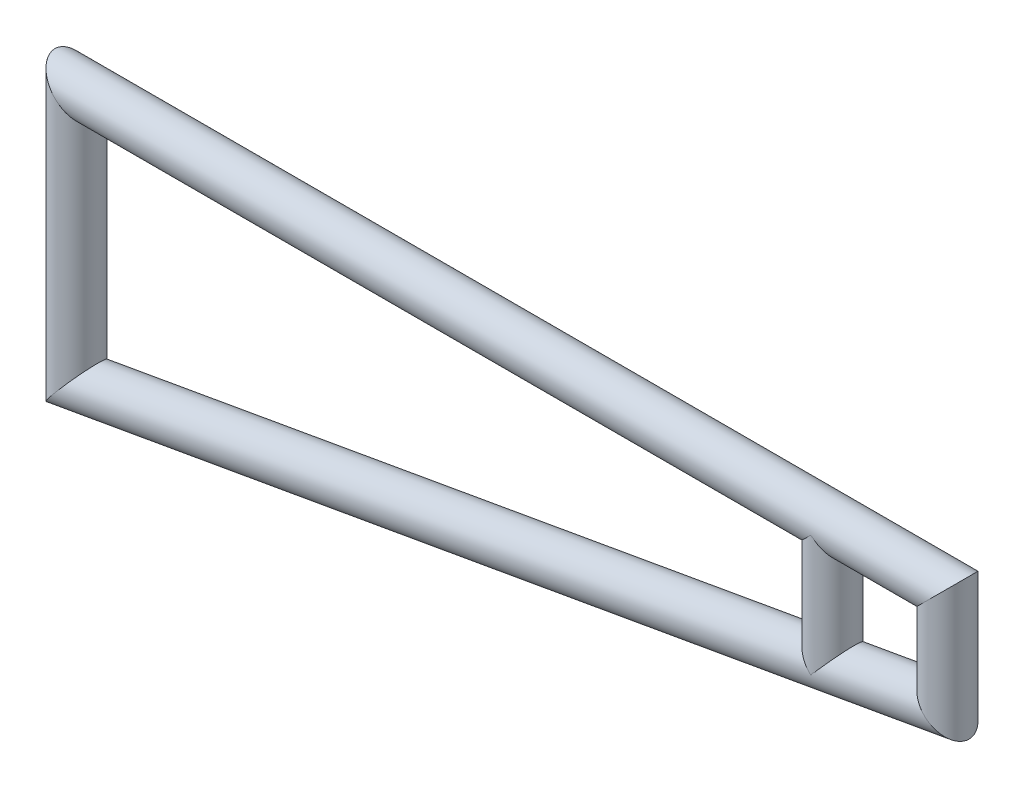
ISO-10303-21;
HEADER;
FILE_DESCRIPTION(('STEP AP214'),'2;1');
FILE_NAME('part.step','',(''),(''),'','','');
FILE_SCHEMA(('AUTOMOTIVE_DESIGN { 1 0 10303 214 1 1 1 1 }'));
ENDSEC;
DATA;
#1=APPLICATION_CONTEXT('core data for automotive mechanical design processes');
#2=APPLICATION_PROTOCOL_DEFINITION('international standard','automotive_design',2000,#1);
#3=PRODUCT_CONTEXT('',#1,'mechanical');
#4=PRODUCT('Part','Part','',(#3));
#5=PRODUCT_RELATED_PRODUCT_CATEGORY('part','',(#4));
#6=PRODUCT_DEFINITION_FORMATION('','',#4);
#7=PRODUCT_DEFINITION_CONTEXT('part definition',#1,'design');
#8=PRODUCT_DEFINITION('design','',#6,#7);
#9=PRODUCT_DEFINITION_SHAPE('','',#8);
#10=(LENGTH_UNIT() NAMED_UNIT(*) SI_UNIT(.MILLI.,.METRE.));
#11=(NAMED_UNIT(*) PLANE_ANGLE_UNIT() SI_UNIT($,.RADIAN.));
#12=(NAMED_UNIT(*) SI_UNIT($,.STERADIAN.) SOLID_ANGLE_UNIT());
#13=UNCERTAINTY_MEASURE_WITH_UNIT(LENGTH_MEASURE(1.E-05),#10,'distance_accuracy_value','');
#14=(GEOMETRIC_REPRESENTATION_CONTEXT(3) GLOBAL_UNCERTAINTY_ASSIGNED_CONTEXT((#13)) GLOBAL_UNIT_ASSIGNED_CONTEXT((#10,
#11,#12)) REPRESENTATION_CONTEXT('',''));
#15=CARTESIAN_POINT('',(0.,0.,0.));
#16=DIRECTION('',(0.,0.,1.));
#17=DIRECTION('',(1.,0.,0.));
#18=AXIS2_PLACEMENT_3D('',#15,#16,#17);
#19=CARTESIAN_POINT('',(0.,125.82060170464,0.));
#20=DIRECTION('',(0.,-1.,0.));
#21=DIRECTION('',(0.,0.,-1.));
#22=AXIS2_PLACEMENT_3D('',#19,#20,#21);
#23=CYLINDRICAL_SURFACE('',#22,7.8994);
#24=CARTESIAN_POINT('',(0.,125.82060170464,0.));
#25=DIRECTION('',(0.707106781186547,0.707106781186548,0.));
#26=DIRECTION('',(0.707106781186548,-0.707106781186547,0.));
#27=AXIS2_PLACEMENT_3D('',#24,#25,#26);
#28=ELLIPSE('',#27,11.17143861461,7.8994);
#29=CARTESIAN_POINT('',(7.8994,117.92120170464,0.));
#30=VERTEX_POINT('',#29);
#31=EDGE_CURVE('E61',#30,#30,#28,.T.);
#32=ORIENTED_EDGE('',*,*,#31,.T.);
#33=EDGE_LOOP('',(#32));
#34=FACE_BOUND('',#33,.T.);
#35=CARTESIAN_POINT('',(0.,0.,0.));
#36=DIRECTION('',(0.766044443118978,-0.642787609686539,0.));
#37=DIRECTION('',(-0.642787609686539,-0.766044443118978,0.));
#38=AXIS2_PLACEMENT_3D('',#35,#36,#37);
#39=ELLIPSE('',#38,12.2892847979011,7.8994);
#40=CARTESIAN_POINT('',(-7.8994,-9.41413832933871,0.));
#41=VERTEX_POINT('',#40);
#42=EDGE_CURVE('E51',#41,#41,#39,.T.);
#43=ORIENTED_EDGE('',*,*,#42,.T.);
#44=EDGE_LOOP('',(#43));
#45=FACE_BOUND('',#44,.T.);
#46=ADVANCED_FACE('F47',(#34,#45),#23,.F.);
#47=CARTESIAN_POINT('',(0.,125.82060170464,0.));
#48=DIRECTION('',(0.,-1.,0.));
#49=DIRECTION('',(0.,0.,-1.));
#50=AXIS2_PLACEMENT_3D('',#47,#48,#49);
#51=CYLINDRICAL_SURFACE('',#50,10.668);
#52=CARTESIAN_POINT('',(0.,125.82060170464,0.));
#53=DIRECTION('',(0.707106781186547,0.707106781186548,0.));
#54=DIRECTION('',(0.707106781186548,-0.707106781186547,0.));
#55=AXIS2_PLACEMENT_3D('',#52,#53,#54);
#56=ELLIPSE('',#55,15.0868302833962,10.668);
#57=CARTESIAN_POINT('',(10.668,115.15260170464,0.));
#58=VERTEX_POINT('',#57);
#59=EDGE_CURVE('E55',#58,#58,#56,.T.);
#60=ORIENTED_EDGE('',*,*,#59,.F.);
#61=EDGE_LOOP('',(#60));
#62=FACE_BOUND('',#61,.T.);
#63=CARTESIAN_POINT('',(0.,0.,0.));
#64=DIRECTION('',(0.766044443118978,-0.642787609686539,0.));
#65=DIRECTION('',(-0.642787609686539,-0.766044443118978,0.));
#66=AXIS2_PLACEMENT_3D('',#63,#64,#65);
#67=ELLIPSE('',#66,16.5964617849469,10.668);
#68=CARTESIAN_POINT('',(-10.668,-12.713627325795,0.));
#69=VERTEX_POINT('',#68);
#70=EDGE_CURVE('E12',#69,#69,#67,.T.);
#71=ORIENTED_EDGE('',*,*,#70,.F.);
#72=EDGE_LOOP('',(#71));
#73=FACE_BOUND('',#72,.T.);
#74=ADVANCED_FACE('F74',(#62,#73),#51,.T.);
#75=CARTESIAN_POINT('',(0.,125.82060170464,0.));
#76=DIRECTION('',(0.707106781186547,0.707106781186548,0.));
#77=DIRECTION('',(-0.707106781186548,0.707106781186547,0.));
#78=AXIS2_PLACEMENT_3D('',#75,#76,#77);
#79=PLANE('',#78);
#80=ORIENTED_EDGE('',*,*,#31,.F.);
#81=EDGE_LOOP('',(#80));
#82=FACE_BOUND('',#81,.T.);
#83=ORIENTED_EDGE('',*,*,#59,.T.);
#84=EDGE_LOOP('',(#83));
#85=FACE_BOUND('',#84,.T.);
#86=ADVANCED_FACE('F70',(#82,#85),#79,.T.);
#87=CARTESIAN_POINT('',(0.,0.,0.));
#88=DIRECTION('',(0.766044443118978,-0.642787609686539,0.));
#89=DIRECTION('',(0.642787609686539,0.766044443118978,0.));
#90=AXIS2_PLACEMENT_3D('',#87,#88,#89);
#91=PLANE('',#90);
#92=ORIENTED_EDGE('',*,*,#42,.F.);
#93=EDGE_LOOP('',(#92));
#94=FACE_BOUND('',#93,.T.);
#95=ORIENTED_EDGE('',*,*,#70,.T.);
#96=EDGE_LOOP('',(#95));
#97=FACE_BOUND('',#96,.T.);
#98=ADVANCED_FACE('F49',(#94,#97),#91,.T.);
#99=CLOSED_SHELL('',(#46,#74,#86,#98));
#100=MANIFOLD_SOLID_BREP('B2',#99);
#101=CARTESIAN_POINT('',(0.,0.,0.));
#102=DIRECTION('',(0.984807753012208,0.173648177666931,0.));
#103=DIRECTION('',(-0.173648177666931,0.984807753012208,0.));
#104=AXIS2_PLACEMENT_3D('',#101,#102,#103);
#105=CYLINDRICAL_SURFACE('',#104,7.8994);
#106=CARTESIAN_POINT('',(430.,75.8206017046404,0.));
#107=DIRECTION('',(0.642787609686539,0.766044443118978,0.));
#108=DIRECTION('',(0.766044443118978,-0.642787609686539,0.));
#109=AXIS2_PLACEMENT_3D('',#106,#107,#108);
#110=ELLIPSE('',#109,10.3119343413514,7.8994);
#111=CARTESIAN_POINT('',(437.8994,69.1922180781186,0.));
#112=VERTEX_POINT('',#111);
#113=EDGE_CURVE('E153',#112,#112,#110,.T.);
#114=ORIENTED_EDGE('',*,*,#113,.T.);
#115=EDGE_LOOP('',(#114));
#116=FACE_BOUND('',#115,.T.);
#117=CARTESIAN_POINT('',(0.,0.,0.));
#118=DIRECTION('',(-0.766044443118978,0.642787609686539,0.));
#119=DIRECTION('',(0.642787609686539,0.766044443118978,0.));
#120=AXIS2_PLACEMENT_3D('',#117,#118,#119);
#121=ELLIPSE('',#120,12.2892847979011,7.8994);
#122=CARTESIAN_POINT('',(7.89940000000004,9.41413832933875,0.));
#123=VERTEX_POINT('',#122);
#124=EDGE_CURVE('E143',#123,#123,#121,.T.);
#125=ORIENTED_EDGE('',*,*,#124,.T.);
#126=EDGE_LOOP('',(#125));
#127=FACE_BOUND('',#126,.T.);
#128=ADVANCED_FACE('F139',(#116,#127),#105,.F.);
#129=CARTESIAN_POINT('',(0.,0.,0.));
#130=DIRECTION('',(0.984807753012208,0.173648177666931,0.));
#131=DIRECTION('',(-0.173648177666931,0.984807753012208,0.));
#132=AXIS2_PLACEMENT_3D('',#129,#130,#131);
#133=CYLINDRICAL_SURFACE('',#132,10.668);
#134=CARTESIAN_POINT('',(430.,75.8206017046404,0.));
#135=DIRECTION('',(0.642787609686539,0.766044443118978,0.));
#136=DIRECTION('',(0.766044443118978,-0.642787609686539,0.));
#137=AXIS2_PLACEMENT_3D('',#134,#135,#136);
#138=ELLIPSE('',#137,13.9260849625967,10.668);
#139=CARTESIAN_POINT('',(440.668,66.8690868392412,0.));
#140=VERTEX_POINT('',#139);
#141=EDGE_CURVE('E147',#140,#140,#138,.T.);
#142=ORIENTED_EDGE('',*,*,#141,.F.);
#143=EDGE_LOOP('',(#142));
#144=FACE_BOUND('',#143,.T.);
#145=CARTESIAN_POINT('',(0.,0.,0.));
#146=DIRECTION('',(-0.766044443118978,0.642787609686539,0.));
#147=DIRECTION('',(0.642787609686539,0.766044443118978,0.));
#148=AXIS2_PLACEMENT_3D('',#145,#146,#147);
#149=ELLIPSE('',#148,16.5964617849469,10.668);
#150=CARTESIAN_POINT('',(10.668,12.7136273257951,0.));
#151=VERTEX_POINT('',#150);
#152=EDGE_CURVE('E46',#151,#151,#149,.T.);
#153=ORIENTED_EDGE('',*,*,#152,.F.);
#154=EDGE_LOOP('',(#153));
#155=FACE_BOUND('',#154,.T.);
#156=ADVANCED_FACE('F166',(#144,#155),#133,.T.);
#157=CARTESIAN_POINT('',(430.,75.8206017046404,0.));
#158=DIRECTION('',(0.642787609686539,0.766044443118978,0.));
#159=DIRECTION('',(-0.766044443118978,0.642787609686539,0.));
#160=AXIS2_PLACEMENT_3D('',#157,#158,#159);
#161=PLANE('',#160);
#162=ORIENTED_EDGE('',*,*,#113,.F.);
#163=EDGE_LOOP('',(#162));
#164=FACE_BOUND('',#163,.T.);
#165=ORIENTED_EDGE('',*,*,#141,.T.);
#166=EDGE_LOOP('',(#165));
#167=FACE_BOUND('',#166,.T.);
#168=ADVANCED_FACE('F162',(#164,#167),#161,.T.);
#169=CARTESIAN_POINT('',(0.,0.,0.));
#170=DIRECTION('',(-0.766044443118978,0.642787609686539,0.));
#171=DIRECTION('',(-0.642787609686539,-0.766044443118978,0.));
#172=AXIS2_PLACEMENT_3D('',#169,#170,#171);
#173=PLANE('',#172);
#174=ORIENTED_EDGE('',*,*,#124,.F.);
#175=EDGE_LOOP('',(#174));
#176=FACE_BOUND('',#175,.T.);
#177=ORIENTED_EDGE('',*,*,#152,.T.);
#178=EDGE_LOOP('',(#177));
#179=FACE_BOUND('',#178,.T.);
#180=ADVANCED_FACE('F141',(#176,#179),#173,.T.);
#181=CLOSED_SHELL('',(#128,#156,#168,#180));
#182=MANIFOLD_SOLID_BREP('B7',#181);
#183=CARTESIAN_POINT('',(430.,125.82060170464,0.));
#184=DIRECTION('',(-1.,0.,0.));
#185=DIRECTION('',(0.,0.,1.));
#186=AXIS2_PLACEMENT_3D('',#183,#184,#185);
#187=CYLINDRICAL_SURFACE('',#186,7.8994);
#188=CARTESIAN_POINT('',(430.,125.82060170464,0.));
#189=DIRECTION('',(0.707106781186548,-0.707106781186547,0.));
#190=DIRECTION('',(-0.707106781186547,-0.707106781186548,0.));
#191=AXIS2_PLACEMENT_3D('',#188,#189,#190);
#192=ELLIPSE('',#191,11.17143861461,7.8994);
#193=CARTESIAN_POINT('',(422.1006,117.92120170464,0.));
#194=VERTEX_POINT('',#193);
#195=EDGE_CURVE('E245',#194,#194,#192,.T.);
#196=ORIENTED_EDGE('',*,*,#195,.T.);
#197=EDGE_LOOP('',(#196));
#198=FACE_BOUND('',#197,.T.);
#199=CARTESIAN_POINT('',(0.,125.82060170464,0.));
#200=DIRECTION('',(-0.707106781186548,-0.707106781186547,0.));
#201=DIRECTION('',(-0.707106781186547,0.707106781186548,0.));
#202=AXIS2_PLACEMENT_3D('',#199,#200,#201);
#203=ELLIPSE('',#202,11.17143861461,7.8994);
#204=CARTESIAN_POINT('',(-7.8994,133.72000170464,0.));
#205=VERTEX_POINT('',#204);
#206=EDGE_CURVE('E235',#205,#205,#203,.T.);
#207=ORIENTED_EDGE('',*,*,#206,.T.);
#208=EDGE_LOOP('',(#207));
#209=FACE_BOUND('',#208,.T.);
#210=ADVANCED_FACE('F231',(#198,#209),#187,.F.);
#211=CARTESIAN_POINT('',(430.,125.82060170464,0.));
#212=DIRECTION('',(-1.,0.,0.));
#213=DIRECTION('',(0.,0.,1.));
#214=AXIS2_PLACEMENT_3D('',#211,#212,#213);
#215=CYLINDRICAL_SURFACE('',#214,10.668);
#216=CARTESIAN_POINT('',(430.,125.82060170464,0.));
#217=DIRECTION('',(0.707106781186548,-0.707106781186547,0.));
#218=DIRECTION('',(-0.707106781186547,-0.707106781186548,0.));
#219=AXIS2_PLACEMENT_3D('',#216,#217,#218);
#220=ELLIPSE('',#219,15.0868302833962,10.668);
#221=CARTESIAN_POINT('',(419.332,115.15260170464,0.));
#222=VERTEX_POINT('',#221);
#223=EDGE_CURVE('E239',#222,#222,#220,.T.);
#224=ORIENTED_EDGE('',*,*,#223,.F.);
#225=EDGE_LOOP('',(#224));
#226=FACE_BOUND('',#225,.T.);
#227=CARTESIAN_POINT('',(0.,125.82060170464,0.));
#228=DIRECTION('',(-0.707106781186548,-0.707106781186547,0.));
#229=DIRECTION('',(-0.707106781186547,0.707106781186548,0.));
#230=AXIS2_PLACEMENT_3D('',#227,#228,#229);
#231=ELLIPSE('',#230,15.0868302833962,10.668);
#232=CARTESIAN_POINT('',(-10.668,136.48860170464,0.));
#233=VERTEX_POINT('',#232);
#234=EDGE_CURVE('E138',#233,#233,#231,.T.);
#235=ORIENTED_EDGE('',*,*,#234,.F.);
#236=EDGE_LOOP('',(#235));
#237=FACE_BOUND('',#236,.T.);
#238=ADVANCED_FACE('F258',(#226,#237),#215,.T.);
#239=CARTESIAN_POINT('',(430.,125.82060170464,0.));
#240=DIRECTION('',(0.707106781186548,-0.707106781186547,0.));
#241=DIRECTION('',(0.707106781186547,0.707106781186548,0.));
#242=AXIS2_PLACEMENT_3D('',#239,#240,#241);
#243=PLANE('',#242);
#244=ORIENTED_EDGE('',*,*,#195,.F.);
#245=EDGE_LOOP('',(#244));
#246=FACE_BOUND('',#245,.T.);
#247=ORIENTED_EDGE('',*,*,#223,.T.);
#248=EDGE_LOOP('',(#247));
#249=FACE_BOUND('',#248,.T.);
#250=ADVANCED_FACE('F254',(#246,#249),#243,.T.);
#251=CARTESIAN_POINT('',(0.,125.82060170464,0.));
#252=DIRECTION('',(-0.707106781186548,-0.707106781186547,0.));
#253=DIRECTION('',(0.707106781186547,-0.707106781186548,0.));
#254=AXIS2_PLACEMENT_3D('',#251,#252,#253);
#255=PLANE('',#254);
#256=ORIENTED_EDGE('',*,*,#206,.F.);
#257=EDGE_LOOP('',(#256));
#258=FACE_BOUND('',#257,.T.);
#259=ORIENTED_EDGE('',*,*,#234,.T.);
#260=EDGE_LOOP('',(#259));
#261=FACE_BOUND('',#260,.T.);
#262=ADVANCED_FACE('F233',(#258,#261),#255,.T.);
#263=CLOSED_SHELL('',(#210,#238,#250,#262));
#264=MANIFOLD_SOLID_BREP('B41',#263);
#265=CARTESIAN_POINT('',(430.,75.8206017046403,0.));
#266=DIRECTION('',(0.,1.,0.));
#267=DIRECTION('',(0.,0.,1.));
#268=AXIS2_PLACEMENT_3D('',#265,#266,#267);
#269=CYLINDRICAL_SURFACE('',#268,7.8994);
#270=CARTESIAN_POINT('',(430.,75.8206017046404,0.));
#271=DIRECTION('',(-0.642787609686539,-0.766044443118979,0.));
#272=DIRECTION('',(-0.766044443118978,0.642787609686539,0.));
#273=AXIS2_PLACEMENT_3D('',#270,#271,#272);
#274=ELLIPSE('',#273,10.3119343413514,7.8994);
#275=CARTESIAN_POINT('',(422.1006,82.4489853311622,0.));
#276=VERTEX_POINT('',#275);
#277=EDGE_CURVE('E338',#276,#276,#274,.T.);
#278=ORIENTED_EDGE('',*,*,#277,.T.);
#279=EDGE_LOOP('',(#278));
#280=FACE_BOUND('',#279,.T.);
#281=CARTESIAN_POINT('',(430.,125.82060170464,0.));
#282=DIRECTION('',(-0.707106781186548,0.707106781186547,0.));
#283=DIRECTION('',(0.707106781186547,0.707106781186548,0.));
#284=AXIS2_PLACEMENT_3D('',#281,#282,#283);
#285=ELLIPSE('',#284,11.17143861461,7.8994);
#286=CARTESIAN_POINT('',(437.8994,133.72000170464,0.));
#287=VERTEX_POINT('',#286);
#288=EDGE_CURVE('E328',#287,#287,#285,.T.);
#289=ORIENTED_EDGE('',*,*,#288,.T.);
#290=EDGE_LOOP('',(#289));
#291=FACE_BOUND('',#290,.T.);
#292=ADVANCED_FACE('F324',(#280,#291),#269,.F.);
#293=CARTESIAN_POINT('',(430.,75.8206017046403,0.));
#294=DIRECTION('',(0.,1.,0.));
#295=DIRECTION('',(0.,0.,1.));
#296=AXIS2_PLACEMENT_3D('',#293,#294,#295);
#297=CYLINDRICAL_SURFACE('',#296,10.668);
#298=CARTESIAN_POINT('',(430.,75.8206017046404,0.));
#299=DIRECTION('',(-0.642787609686539,-0.766044443118979,0.));
#300=DIRECTION('',(-0.766044443118978,0.642787609686539,0.));
#301=AXIS2_PLACEMENT_3D('',#298,#299,#300);
#302=ELLIPSE('',#301,13.9260849625967,10.668);
#303=CARTESIAN_POINT('',(419.332,84.7721165700396,0.));
#304=VERTEX_POINT('',#303);
#305=EDGE_CURVE('E332',#304,#304,#302,.T.);
#306=ORIENTED_EDGE('',*,*,#305,.F.);
#307=EDGE_LOOP('',(#306));
#308=FACE_BOUND('',#307,.T.);
#309=CARTESIAN_POINT('',(430.,125.82060170464,0.));
#310=DIRECTION('',(-0.707106781186548,0.707106781186547,0.));
#311=DIRECTION('',(0.707106781186547,0.707106781186548,0.));
#312=AXIS2_PLACEMENT_3D('',#309,#310,#311);
#313=ELLIPSE('',#312,15.0868302833962,10.668);
#314=CARTESIAN_POINT('',(440.668,136.48860170464,0.));
#315=VERTEX_POINT('',#314);
#316=EDGE_CURVE('E230',#315,#315,#313,.T.);
#317=ORIENTED_EDGE('',*,*,#316,.F.);
#318=EDGE_LOOP('',(#317));
#319=FACE_BOUND('',#318,.T.);
#320=ADVANCED_FACE('F351',(#308,#319),#297,.T.);
#321=CARTESIAN_POINT('',(430.,75.8206017046404,0.));
#322=DIRECTION('',(-0.642787609686539,-0.766044443118979,0.));
#323=DIRECTION('',(0.766044443118978,-0.642787609686539,0.));
#324=AXIS2_PLACEMENT_3D('',#321,#322,#323);
#325=PLANE('',#324);
#326=ORIENTED_EDGE('',*,*,#277,.F.);
#327=EDGE_LOOP('',(#326));
#328=FACE_BOUND('',#327,.T.);
#329=ORIENTED_EDGE('',*,*,#305,.T.);
#330=EDGE_LOOP('',(#329));
#331=FACE_BOUND('',#330,.T.);
#332=ADVANCED_FACE('F347',(#328,#331),#325,.T.);
#333=CARTESIAN_POINT('',(430.,125.82060170464,0.));
#334=DIRECTION('',(-0.707106781186548,0.707106781186547,0.));
#335=DIRECTION('',(-0.707106781186547,-0.707106781186548,0.));
#336=AXIS2_PLACEMENT_3D('',#333,#334,#335);
#337=PLANE('',#336);
#338=ORIENTED_EDGE('',*,*,#288,.F.);
#339=EDGE_LOOP('',(#338));
#340=FACE_BOUND('',#339,.T.);
#341=ORIENTED_EDGE('',*,*,#316,.T.);
#342=EDGE_LOOP('',(#341));
#343=FACE_BOUND('',#342,.T.);
#344=ADVANCED_FACE('F326',(#340,#343),#337,.T.);
#345=CLOSED_SHELL('',(#292,#320,#332,#344));
#346=MANIFOLD_SOLID_BREP('B133',#345);
#347=CARTESIAN_POINT('',(373.287181803823,65.8206017046404,0.));
#348=DIRECTION('',(0.,1.,0.));
#349=DIRECTION('',(0.,0.,1.));
#350=AXIS2_PLACEMENT_3D('',#347,#348,#349);
#351=CYLINDRICAL_SURFACE('',#350,7.8994);
#352=CARTESIAN_POINT('',(373.287181803823,118.650824606292,7.8994));
#353=CARTESIAN_POINT('',(373.472592037183,118.650821739568,7.89939862302274));
#354=CARTESIAN_POINT('',(373.658028702108,118.643592902203,7.89285461644663));
#355=CARTESIAN_POINT('',(374.026920029612,118.615113719013,7.86686245380208));
#356=CARTESIAN_POINT('',(374.210374173535,118.593859790158,7.84741100022344));
#357=CARTESIAN_POINT('',(374.573923363847,118.538497272383,7.79606283536288));
#358=CARTESIAN_POINT('',(374.75401068206,118.504362200233,7.76414047949351));
#359=CARTESIAN_POINT('',(375.109257128672,118.424951275809,7.6885353604366));
#360=CARTESIAN_POINT('',(375.28441330943,118.379668911342,7.64484572145131));
#361=CARTESIAN_POINT('',(375.626516080542,118.280592846337,7.54713520819791));
#362=CARTESIAN_POINT('',(375.79354240326,118.226924640039,7.49326453284778));
#363=CARTESIAN_POINT('',(376.121424240177,118.112486215787,7.3754960292405));
#364=CARTESIAN_POINT('',(376.28228039991,118.051716743487,7.31159925351447));
#365=CARTESIAN_POINT('',(376.755275864847,117.861337631017,7.1057087317883));
#366=CARTESIAN_POINT('',(377.058088919044,117.723581016258,6.9494428716133));
#367=CARTESIAN_POINT('',(377.521879343254,117.495007657165,6.6715141610299));
#368=CARTESIAN_POINT('',(377.691292296085,117.407360514528,6.56087606445238));
#369=CARTESIAN_POINT('',(378.020633813314,117.230376688343,6.32737567751919));
#370=CARTESIAN_POINT('',(378.18056161104,117.141039868989,6.20451240116305));
#371=CARTESIAN_POINT('',(378.490828128089,116.962411368081,5.94670748966839));
#372=CARTESIAN_POINT('',(378.641153133767,116.8731199241,5.81174921431244));
#373=CARTESIAN_POINT('',(378.931571850779,116.696371680899,5.53012578339758));
#374=CARTESIAN_POINT('',(379.071665539304,116.60891488577,5.38346060174179));
#375=CARTESIAN_POINT('',(379.367595194239,116.420513311941,5.04860061097395));
#376=CARTESIAN_POINT('',(379.521098759441,116.320303775458,4.85791504920804));
#377=CARTESIAN_POINT('',(379.811340811017,116.127376850364,4.46053864030585));
#378=CARTESIAN_POINT('',(379.948075666179,116.034661085983,4.25384434228289));
#379=CARTESIAN_POINT('',(380.202859203797,115.8594893341,3.82568500223123));
#380=CARTESIAN_POINT('',(380.320942051517,115.77701464852,3.60424804802914));
#381=CARTESIAN_POINT('',(380.536791072299,115.624686313849,3.14759886806422));
#382=CARTESIAN_POINT('',(380.634567602655,115.554826233031,2.91239374365862));
#383=CARTESIAN_POINT('',(380.782250885536,115.448524698911,2.50141435248169));
#384=CARTESIAN_POINT('',(380.837766330911,115.408307411922,2.32860804889637));
#385=CARTESIAN_POINT('',(380.937095330283,115.336055192159,1.97800783533073));
#386=CARTESIAN_POINT('',(380.980911624746,115.304018343236,1.80021510419764));
#387=CARTESIAN_POINT('',(381.056240669805,115.248784260288,1.44081057948632));
#388=CARTESIAN_POINT('',(381.08776153456,115.225581196801,1.25920138820825));
#389=CARTESIAN_POINT('',(381.138085432209,115.188475774467,0.89327395402296));
#390=CARTESIAN_POINT('',(381.156888013728,115.174573745718,0.708955615204549));
#391=CARTESIAN_POINT('',(381.181513267718,115.156357531583,0.338516516031186));
#392=CARTESIAN_POINT('',(381.187303546699,115.152067274314,0.152392413354144));
#393=CARTESIAN_POINT('',(381.18571639607,115.15324251517,-0.219767814756798));
#394=CARTESIAN_POINT('',(381.17833901788,115.158707975197,-0.405803940531413));
#395=CARTESIAN_POINT('',(381.150531469457,115.179272635939,-0.776395038390029));
#396=CARTESIAN_POINT('',(381.130098609074,115.194373822144,-0.960949697272015));
#397=CARTESIAN_POINT('',(381.076492520117,115.233877132438,-1.32718145166138));
#398=CARTESIAN_POINT('',(381.043319356611,115.258279209025,-1.50885856185997));
#399=CARTESIAN_POINT('',(380.9659853746,115.314933759287,-1.86229982991501));
#400=CARTESIAN_POINT('',(380.922214268122,115.346907062004,-2.03419460619131));
#401=CARTESIAN_POINT('',(380.823720498925,115.418487716102,-2.37324342542955));
#402=CARTESIAN_POINT('',(380.768994018137,115.458097728782,-2.54039579235625));
#403=CARTESIAN_POINT('',(380.64921738796,115.544243502015,-2.86906480771295));
#404=CARTESIAN_POINT('',(380.58416990436,115.590777473999,-3.03058289830309));
#405=CARTESIAN_POINT('',(380.444366107138,115.690025289691,-3.34742475157524));
#406=CARTESIAN_POINT('',(380.369606270476,115.742741375208,-3.5027462396594));
#407=CARTESIAN_POINT('',(380.114416521307,115.921061170568,-3.99170976424425));
#408=CARTESIAN_POINT('',(379.916096364926,116.05730333406,-4.31236415027143));
#409=CARTESIAN_POINT('',(379.480725114323,116.347522031368,-4.91729760865646));
#410=CARTESIAN_POINT('',(379.243639115301,116.501514510373,-5.20154348358174));
#411=CARTESIAN_POINT('',(378.837724651287,116.754169102868,-5.62494971257208));
#412=CARTESIAN_POINT('',(378.679860625739,116.85013788545,-5.77643778341737));
#413=CARTESIAN_POINT('',(378.352419362421,117.043084523939,-6.06560876358247));
#414=CARTESIAN_POINT('',(378.182839832991,117.1400625741,-6.20328895896582));
#415=CARTESIAN_POINT('',(377.832344476536,117.332800493791,-6.46450429521858));
#416=CARTESIAN_POINT('',(377.651424015741,117.428559845896,-6.5880335951418));
#417=CARTESIAN_POINT('',(377.278539721568,117.616292515772,-6.82039763004433));
#418=CARTESIAN_POINT('',(377.086578553057,117.708266738031,-6.92923588991341));
#419=CARTESIAN_POINT('',(376.732558132756,117.867190105871,-7.11061624891307));
#420=CARTESIAN_POINT('',(376.572515754561,117.935383376221,-7.18601135072727));
#421=CARTESIAN_POINT('',(376.245611708314,118.065890313076,-7.32665533601459));
#422=CARTESIAN_POINT('',(376.078747991575,118.128202194323,-7.39190114260263));
#423=CARTESIAN_POINT('',(375.738819394378,118.244929944815,-7.51148423433849));
#424=CARTESIAN_POINT('',(375.565766249991,118.299359862587,-7.56584099573482));
#425=CARTESIAN_POINT('',(375.213793418719,118.39840055578,-7.66302657785807));
#426=CARTESIAN_POINT('',(375.034877898406,118.443018138368,-7.70586339500705));
#427=CARTESIAN_POINT('',(374.70521106093,118.513377333539,-7.77255406048423));
#428=CARTESIAN_POINT('',(374.555289682916,118.541078521752,-7.79844654436961));
#429=CARTESIAN_POINT('',(374.252906465611,118.587619163929,-7.84163253580711));
#430=CARTESIAN_POINT('',(374.10044590107,118.606462933522,-7.85893023126206));
#431=CARTESIAN_POINT('',(373.794002140282,118.634551676684,-7.88462268875399));
#432=CARTESIAN_POINT('',(373.640020155973,118.643803752356,-7.89302403812937));
#433=CARTESIAN_POINT('',(373.331546851538,118.65234527851,-7.90078205474054));
#434=CARTESIAN_POINT('',(373.177055523392,118.65163457134,-7.90013857885064));
#435=CARTESIAN_POINT('',(372.868806107324,118.640278650354,-7.88981921430052));
#436=CARTESIAN_POINT('',(372.715047743259,118.629637534129,-7.8801470511536));
#437=CARTESIAN_POINT('',(372.409329615326,118.598888306657,-7.8519736360786));
#438=CARTESIAN_POINT('',(372.257369851635,118.578780194482,-7.83347238328602));
#439=CARTESIAN_POINT('',(371.805255444129,118.50530182321,-7.76512950550886));
#440=CARTESIAN_POINT('',(371.509094789406,118.438787789109,-7.70245711938604));
#441=CARTESIAN_POINT('',(370.820686343806,118.24824351989,-7.51592825136076));
#442=CARTESIAN_POINT('',(370.435794162796,118.111907995784,-7.37776240615505));
#443=CARTESIAN_POINT('',(369.884955399509,117.886324935734,-7.13204101624547));
#444=CARTESIAN_POINT('',(369.705530112281,117.807494019583,-7.04357317866216));
#445=CARTESIAN_POINT('',(369.355496474959,117.645039038222,-6.85433487500683));
#446=CARTESIAN_POINT('',(369.184887240465,117.56141545558,-6.75356564639605));
#447=CARTESIAN_POINT('',(368.847134863992,117.388640900308,-6.5366761775231));
#448=CARTESIAN_POINT('',(368.680296499428,117.299398595437,-6.4201563917385));
#449=CARTESIAN_POINT('',(368.35634547924,117.119988752894,-6.17484053429182));
#450=CARTESIAN_POINT('',(368.199235438266,117.029820974011,-6.04604118571012));
#451=CARTESIAN_POINT('',(367.895219401039,116.850433633477,-5.77654709550639));
#452=CARTESIAN_POINT('',(367.748306475144,116.761213463484,-5.63586057909034));
#453=CARTESIAN_POINT('',(367.465046771018,116.585308451023,-5.34273336577176));
#454=CARTESIAN_POINT('',(367.328700129351,116.498623641332,-5.19029251700057));
#455=CARTESIAN_POINT('',(367.067427006487,116.329492352742,-4.87413185678046));
#456=CARTESIAN_POINT('',(366.942484326632,116.247039937247,-4.71042864177196));
#457=CARTESIAN_POINT('',(366.704676551504,116.087807395169,-4.37194500399844));
#458=CARTESIAN_POINT('',(366.591807000979,116.011025179419,-4.19716870562096));
#459=CARTESIAN_POINT('',(366.379133508584,115.864654342542,-3.83706812714722));
#460=CARTESIAN_POINT('',(366.279323735459,115.795062513812,-3.65174860805059));
#461=CARTESIAN_POINT('',(366.093834610124,115.664539238131,-3.27124572621874));
#462=CARTESIAN_POINT('',(366.008152805252,115.603606288226,-3.07606408328271));
#463=CARTESIAN_POINT('',(365.863935706728,115.500322776134,-2.70720875368629));
#464=CARTESIAN_POINT('',(365.803253922881,115.456555497482,-2.53476898490439));
#465=CARTESIAN_POINT('',(365.693594403713,115.37709443689,-2.18440619664746));
#466=CARTESIAN_POINT('',(365.644614606144,115.341399232461,-2.00648414956709));
#467=CARTESIAN_POINT('',(365.559010928792,115.278805069574,-1.64625353060111));
#468=CARTESIAN_POINT('',(365.522381315596,115.251902029647,-1.46394703636708));
#469=CARTESIAN_POINT('',(365.461974536242,115.207442245314,-1.09608023180723));
#470=CARTESIAN_POINT('',(365.438197514687,115.189885606065,-0.910519884896851));
#471=CARTESIAN_POINT('',(365.403813364737,115.164473581464,-0.536946655126919));
#472=CARTESIAN_POINT('',(365.393246408949,115.156647788589,-0.348928039755802));
#473=CARTESIAN_POINT('',(365.385586553495,115.150976386921,0.0275356371592999));
#474=CARTESIAN_POINT('',(365.388493680848,115.153130798141,0.215980699557673));
#475=CARTESIAN_POINT('',(365.407735183247,115.167370217723,0.591822158797344));
#476=CARTESIAN_POINT('',(365.424070936563,115.179456245434,0.779218446007964));
#477=CARTESIAN_POINT('',(365.469910077347,115.213283387706,1.1515024437202));
#478=CARTESIAN_POINT('',(365.499413246243,115.235024342,1.33639019580968));
#479=CARTESIAN_POINT('',(365.569489386758,115.286469476748,1.69392894476948));
#480=CARTESIAN_POINT('',(365.60949173192,115.315762077277,1.86675195977659));
#481=CARTESIAN_POINT('',(365.700577483672,115.382148901063,2.20797479910349));
#482=CARTESIAN_POINT('',(365.75166472353,115.419245822996,2.37637307066191));
#483=CARTESIAN_POINT('',(365.864315507177,115.50056651787,2.70780318476419));
#484=CARTESIAN_POINT('',(365.925876366265,115.5447884643,2.87083638978624));
#485=CARTESIAN_POINT('',(366.058865770012,115.639634424911,3.19093123903602));
#486=CARTESIAN_POINT('',(366.130297914411,115.690260773998,3.34799067805678));
#487=CARTESIAN_POINT('',(366.373372073784,115.861071108703,3.83946940537441));
#488=CARTESIAN_POINT('',(366.562764519819,115.992085536907,4.1615672282617));
#489=CARTESIAN_POINT('',(366.980165832559,116.272816183898,4.77061219592638));
#490=CARTESIAN_POINT('',(367.208204765428,116.422546939616,5.05753167084395));
#491=CARTESIAN_POINT('',(367.599160577979,116.669288109078,5.48578042946233));
#492=CARTESIAN_POINT('',(367.751160680345,116.763155370446,5.63909360702115));
#493=CARTESIAN_POINT('',(368.066686642751,116.952494849834,5.93239890097494));
#494=CARTESIAN_POINT('',(368.230214556598,117.047967351526,6.0723886331569));
#495=CARTESIAN_POINT('',(368.568419984097,117.238476095719,6.33878386089749));
#496=CARTESIAN_POINT('',(368.743104756337,117.333512010187,6.46518036629135));
#497=CARTESIAN_POINT('',(369.103254998374,117.520765956153,6.70387541548618));
#498=CARTESIAN_POINT('',(369.288718424519,117.612984516801,6.81617661910469));
#499=CARTESIAN_POINT('',(369.638675504443,117.777121495233,7.00870133648381));
#500=CARTESIAN_POINT('',(369.801548139362,117.849870752459,7.09115627722264));
#501=CARTESIAN_POINT('',(370.134551944378,117.989770798091,7.24535441503385));
#502=CARTESIAN_POINT('',(370.304683229955,118.056921497377,7.31709744160513));
#503=CARTESIAN_POINT('',(370.825120391143,118.246736038351,7.51505725805097));
#504=CARTESIAN_POINT('',(371.186436129812,118.358238633042,7.62454305555703));
#505=CARTESIAN_POINT('',(371.838224219251,118.51087692682,7.77062132367613));
#506=CARTESIAN_POINT('',(372.123591825854,118.562665785253,7.81863208003321));
#507=CARTESIAN_POINT('',(372.557133677718,118.61519079099,7.86694136377351));
#508=CARTESIAN_POINT('',(372.702555326605,118.628506042484,7.87909330157765));
#509=CARTESIAN_POINT('',(372.994373225653,118.646323195074,7.89532235074812));
#510=CARTESIAN_POINT('',(373.140769273699,118.650826870053,7.8994010873549));
#511=CARTESIAN_POINT('',(373.287181803823,118.650824606292,7.8994));
#512=B_SPLINE_CURVE_WITH_KNOTS('',3,(#352,#353,#354,#355,#356,#357,#358,#359,#360,#361,#362,
#363,#364,#365,#366,#367,#368,#369,#370,#371,#372,#373,#374,#375,#376,#377,#378,#379,#380,#381,
#382,#383,#384,#385,#386,#387,#388,#389,#390,#391,#392,#393,#394,#395,#396,#397,#398,#399,#400,
#401,#402,#403,#404,#405,#406,#407,#408,#409,#410,#411,#412,#413,#414,#415,#416,#417,#418,#419,
#420,#421,#422,#423,#424,#425,#426,#427,#428,#429,#430,#431,#432,#433,#434,#435,#436,#437,#438,
#439,#440,#441,#442,#443,#444,#445,#446,#447,#448,#449,#450,#451,#452,#453,#454,#455,#456,#457,
#458,#459,#460,#461,#462,#463,#464,#465,#466,#467,#468,#469,#470,#471,#472,#473,#474,#475,#476,
#477,#478,#479,#480,#481,#482,#483,#484,#485,#486,#487,#488,#489,#490,#491,#492,#493,#494,#495,
#496,#497,#498,#499,#500,#501,#502,#503,#504,#505,#506,#507,#508,#509,#510,#511),.UNSPECIFIED.,
.T.,.F.,(4,2,2,2,2,2,2,2,2,2,2,2,2,2,2,2,2,2,2,2,2,2,2,2,2,2,2,2,2,2,2,2,2,2,2,2,2,2,2,2,2,2,2,
2,2,2,2,2,2,2,2,2,2,2,2,2,2,2,2,2,2,2,2,2,2,2,2,2,2,2,2,2,2,2,2,2,2,2,2,4),(0.,
0.556027337201786,1.11219677935051,1.66951597423417,2.22716152811995,2.77714504741934,
3.32707086851762,4.42612518572632,5.08722245098325,5.74837307916816,6.41044770275263,
7.07252380226555,7.864974071403,8.65759564126934,9.44874807878404,10.2394959903869,
10.796661278876,11.3536959394888,11.9103623701674,12.4670485560465,13.0251190569256,
13.5831873785237,14.1413707301626,14.6995512310979,15.2396939347986,15.7800252130163,
16.3202171567346,16.8606055986917,18.0585353154418,19.2575496496669,19.9736803145211,
20.6899514600551,21.4065171975745,22.1229106993565,22.6912824665937,23.2598262083907,
23.8273437852114,24.3944664041587,24.8579229202545,25.3211533901951,25.7840406187471,
26.2469351720541,26.7096388052625,27.1723424837759,28.0984296061093,29.3841997609478,
30.0288644847079,30.6734644116297,31.3395368902246,32.0057876168759,32.6715810552417,
33.3373830972529,34.0022241893483,34.6668190878077,35.3311162213341,35.9952979090306,
36.5586355622741,37.1218738647607,37.684850329943,38.2478331289914,38.812523860593,
39.3772157245578,39.941965553888,40.5067060090182,41.045509919904,41.5845004523703,
42.1233530330144,42.6624026369864,43.8455666411112,45.0296553836796,45.7353078319633,
46.4410863193294,47.1473287540793,47.8534377181664,48.4424828010146,49.0315372586706,
50.2060665389707,51.08448481723,51.5236502371533,51.9627272383677),.UNSPECIFIED.);
#513=CARTESIAN_POINT('',(373.287181803823,118.650824606292,7.8994));
#514=VERTEX_POINT('',#513);
#515=EDGE_CURVE('E456',#514,#514,#512,.T.);
#516=ORIENTED_EDGE('',*,*,#515,.T.);
#517=EDGE_LOOP('',(#516));
#518=FACE_BOUND('',#517,.T.);
#519=CARTESIAN_POINT('',(373.287181803823,73.1009841715923,7.8994));
#520=CARTESIAN_POINT('',(373.116673699261,73.0709206541311,7.89939921108715));
#521=CARTESIAN_POINT('',(372.945086467078,73.0468674807005,7.8938680857522));
#522=CARTESIAN_POINT('',(372.601350161166,73.0112133636417,7.87145612803299));
#523=CARTESIAN_POINT('',(372.429201051337,72.9996132365422,7.85457455153365));
#524=CARTESIAN_POINT('',(372.085866884985,72.9886277081906,7.80944098734051));
#525=CARTESIAN_POINT('',(371.91468278852,72.98925285561,7.78117920073789));
#526=CARTESIAN_POINT('',(371.574967744748,73.0018961531276,7.71354979624618));
#527=CARTESIAN_POINT('',(371.40643694024,73.0139149143075,7.67418158275771));
#528=CARTESIAN_POINT('',(371.074864884198,73.0478928856588,7.58520665273773));
#529=CARTESIAN_POINT('',(370.911786864589,73.0697573406357,7.53569992993523));
#530=CARTESIAN_POINT('',(370.590344133495,73.1219222725419,7.42673763326674));
#531=CARTESIAN_POINT('',(370.431981814903,73.1522269541987,7.36727710654903));
#532=CARTESIAN_POINT('',(369.964758550995,73.2535296712802,7.17463992187577));
#533=CARTESIAN_POINT('',(369.663858050644,73.3349047827188,7.02723397681176));
#534=CARTESIAN_POINT('',(369.175580126364,73.4862700541291,6.74895043859698));
#535=CARTESIAN_POINT('',(368.981691603484,73.5520962143815,6.62687167009497));
#536=CARTESIAN_POINT('',(368.606189600905,73.6883649720163,6.36717371334205));
#537=CARTESIAN_POINT('',(368.42457986699,73.7588089653278,6.22954981676425));
#538=CARTESIAN_POINT('',(368.074193158167,73.9015736550004,5.93944997469129));
#539=CARTESIAN_POINT('',(367.905426876865,73.9738958494126,5.78696188889006));
#540=CARTESIAN_POINT('',(367.581541779396,74.117958894401,5.46789282519254));
#541=CARTESIAN_POINT('',(367.426421660823,74.1896997998615,5.30131319519456));
#542=CARTESIAN_POINT('',(367.129542059247,74.3309849855448,4.95344903006178));
#543=CARTESIAN_POINT('',(366.987888241774,74.4005094350362,4.77206613099558));
#544=CARTESIAN_POINT('',(366.720214060306,74.5348318833641,4.39643437108052));
#545=CARTESIAN_POINT('',(366.594194166281,74.5996297400907,4.20218512372607));
#546=CARTESIAN_POINT('',(366.359021008281,74.7226283676891,3.80196360419771));
#547=CARTESIAN_POINT('',(366.249853562725,74.7808346743332,3.59600139061487));
#548=CARTESIAN_POINT('',(366.049475657674,74.8890523040116,3.17345018880982));
#549=CARTESIAN_POINT('',(365.958263548378,74.9390643798901,2.95686217921043));
#550=CARTESIAN_POINT('',(365.799501904022,75.0269307007508,2.5268107886873));
#551=CARTESIAN_POINT('',(365.730925452743,75.0653030193383,2.31383284867267));
#552=CARTESIAN_POINT('',(365.611818815118,75.1323613181398,1.88138511092961));
#553=CARTESIAN_POINT('',(365.561288147315,75.1610475567755,1.66191548656731));
#554=CARTESIAN_POINT('',(365.479074533115,75.2078929956195,1.2185179348671));
#555=CARTESIAN_POINT('',(365.447378583203,75.2260594584748,0.994593193990047));
#556=CARTESIAN_POINT('',(365.403306310071,75.2513545268145,0.544240497867416));
#557=CARTESIAN_POINT('',(365.390927688446,75.258484445443,0.317812843651333));
#558=CARTESIAN_POINT('',(365.386015648873,75.2613122895949,-0.10714253841025));
#559=CARTESIAN_POINT('',(365.391206710006,75.2583210614199,-0.305639778638224));
#560=CARTESIAN_POINT('',(365.41648272064,75.2437902097037,-0.701369077653795));
#561=CARTESIAN_POINT('',(365.436567323063,75.2322507853694,-0.898601165816415));
#562=CARTESIAN_POINT('',(365.491369728455,75.2008890686558,-1.29032950137679));
#563=CARTESIAN_POINT('',(365.526086367129,75.1810674353062,-1.48482596518037));
#564=CARTESIAN_POINT('',(365.609727270827,75.1335861079207,-1.86976138254591));
#565=CARTESIAN_POINT('',(365.658651918942,75.1059262025415,-2.06020022655341));
#566=CARTESIAN_POINT('',(365.76930400747,75.0438459967254,-2.43295284187113));
#567=CARTESIAN_POINT('',(365.830825710999,75.0095347548849,-2.615346087627));
#568=CARTESIAN_POINT('',(365.966520212448,74.9345778683806,-2.97409304422272));
#569=CARTESIAN_POINT('',(366.04069786787,74.8939297920854,-3.15044440479294));
#570=CARTESIAN_POINT('',(366.201012416316,74.8071170448611,-3.49614345361203));
#571=CARTESIAN_POINT('',(366.287146099656,74.7609538549669,-3.66549300576461));
#572=CARTESIAN_POINT('',(366.470738140786,74.6639754829538,-3.99655498006484));
#573=CARTESIAN_POINT('',(366.568197650782,74.6131598276388,-4.1582666228297));
#574=CARTESIAN_POINT('',(366.784169036661,74.5025170767068,-4.48934796041604));
#575=CARTESIAN_POINT('',(366.903812606349,74.442297831353,-4.6578488501987));
#576=CARTESIAN_POINT('',(367.155292711835,74.3187269861689,-4.98426665363484));
#577=CARTESIAN_POINT('',(367.287130001989,74.2553751926589,-5.1421829114341));
#578=CARTESIAN_POINT('',(367.562580851549,74.1268948502542,-5.44717964627509));
#579=CARTESIAN_POINT('',(367.706215406282,74.061763277619,-5.59423987990913));
#580=CARTESIAN_POINT('',(368.004488329013,73.9314599094504,-5.87672239963671));
#581=CARTESIAN_POINT('',(368.159127017871,73.8662881127992,-6.01214434612773));
#582=CARTESIAN_POINT('',(368.498492551493,73.7298559829903,-6.28667271340761));
#583=CARTESIAN_POINT('',(368.684587296568,73.6588244186955,-6.42420837433822));
#584=CARTESIAN_POINT('',(369.069520517096,73.521912379547,-6.68323871393472));
#585=CARTESIAN_POINT('',(369.268362398078,73.4560332917545,-6.80472907918185));
#586=CARTESIAN_POINT('',(369.677612407873,73.3330311853639,-7.03036275387373));
#587=CARTESIAN_POINT('',(369.887991701183,73.2758875780596,-7.13454690431206));
#588=CARTESIAN_POINT('',(370.319717730055,73.1741316248183,-7.3246299793828));
#589=CARTESIAN_POINT('',(370.541056745387,73.1295106014159,-7.41054155586384));
#590=CARTESIAN_POINT('',(370.915023080932,73.0695256089304,-7.53643116886265));
#591=CARTESIAN_POINT('',(371.065012338916,73.0493789501077,-7.58203085447652));
#592=CARTESIAN_POINT('',(371.368253682958,73.0174195562621,-7.66439142217139));
#593=CARTESIAN_POINT('',(371.521504727593,73.0056042011482,-7.70115508067319));
#594=CARTESIAN_POINT('',(371.83012294138,72.9913117605361,-7.76545587885101));
#595=CARTESIAN_POINT('',(371.985486415462,72.9888200609621,-7.79300739602447));
#596=CARTESIAN_POINT('',(372.297440891631,72.993842508412,-7.8387359846863));
#597=CARTESIAN_POINT('',(372.454031914087,73.0013568218243,-7.85691290027892));
#598=CARTESIAN_POINT('',(372.767533456647,73.0267292670894,-7.88386276316071));
#599=CARTESIAN_POINT('',(372.924443928584,73.0446099265995,-7.89261511068235));
#600=CARTESIAN_POINT('',(373.236992376277,73.0905840656705,-7.90078770450793));
#601=CARTESIAN_POINT('',(373.392630366772,73.1186774267615,-7.90020805906198));
#602=CARTESIAN_POINT('',(373.701689525579,73.1845423991073,-7.89003345006025));
#603=CARTESIAN_POINT('',(373.855108499338,73.2223229802953,-7.88043010888582));
#604=CARTESIAN_POINT('',(374.158759558822,73.3066532948273,-7.85265313702587));
#605=CARTESIAN_POINT('',(374.308989708677,73.3532081945225,-7.83447444761799));
#606=CARTESIAN_POINT('',(374.852213668712,73.5378758582716,-7.75309375860781));
#607=CARTESIAN_POINT('',(375.233900652341,73.6996091509507,-7.66526545542905));
#608=CARTESIAN_POINT('',(375.782347268371,73.9671702991301,-7.49743820844434));
#609=CARTESIAN_POINT('',(375.961464143644,74.0607179422198,-7.43533005318306));
#610=CARTESIAN_POINT('',(376.311988752754,74.253998205464,-7.29974587866715));
#611=CARTESIAN_POINT('',(376.483396382661,74.3537309089564,-7.22626970621942));
#612=CARTESIAN_POINT('',(376.883474778173,74.5968133558476,-7.03799045483268));
#613=CARTESIAN_POINT('',(377.108618293851,74.7420986631761,-6.91820172599257));
#614=CARTESIAN_POINT('',(377.544681471171,75.0363404225795,-6.6587225207809));
#615=CARTESIAN_POINT('',(377.75559525105,75.1852983583933,-6.5190238881474));
#616=CARTESIAN_POINT('',(378.163074751605,75.4830491408599,-6.22012912322409));
#617=CARTESIAN_POINT('',(378.359646105993,75.6318420294787,-6.06094071304823));
#618=CARTESIAN_POINT('',(378.738020805637,75.9258788764387,-5.72303862473406));
#619=CARTESIAN_POINT('',(378.919829528499,76.0711241134851,-5.54433211261839));
#620=CARTESIAN_POINT('',(379.230369802183,76.3243402364598,-5.20765105349216));
#621=CARTESIAN_POINT('',(379.362124192615,76.4336265659203,-5.05344542885419));
#622=CARTESIAN_POINT('',(379.615159397628,76.6463289167892,-4.73275185837674));
#623=CARTESIAN_POINT('',(379.736438092235,76.7497437485332,-4.56626143903466));
#624=CARTESIAN_POINT('',(379.967260213882,76.9487239196151,-4.22138056448796));
#625=CARTESIAN_POINT('',(380.076823211539,77.0443022851211,-4.04301078874782));
#626=CARTESIAN_POINT('',(380.28316209281,77.2258938907842,-3.67441856929939));
#627=CARTESIAN_POINT('',(380.37994236832,77.311910414588,-3.48420022975743));
#628=CARTESIAN_POINT('',(380.540195735324,77.4553335032275,-3.13417802071745));
#629=CARTESIAN_POINT('',(380.606375197588,77.5149343110869,-2.97650816395482));
#630=CARTESIAN_POINT('',(380.729119206607,77.6259767662445,-2.65475271299112));
#631=CARTESIAN_POINT('',(380.785688533551,77.6774224691261,-2.49067035869386));
#632=CARTESIAN_POINT('',(380.888450895116,77.7712072962145,-2.15678610780082));
#633=CARTESIAN_POINT('',(380.934646732842,77.8135488803885,-1.98698577060436));
#634=CARTESIAN_POINT('',(381.015943379156,77.8882554623834,-1.64257893151507));
#635=CARTESIAN_POINT('',(381.05104407277,77.9206203568205,-1.46797237983805));
#636=CARTESIAN_POINT('',(381.109701431887,77.9747964827481,-1.11403885483605));
#637=CARTESIAN_POINT('',(381.133183587252,77.9965395852962,-0.934688991255888));
#638=CARTESIAN_POINT('',(381.167800810836,78.0286182227543,-0.573780416362322));
#639=CARTESIAN_POINT('',(381.178935893472,78.0389537709853,-0.392221707628517));
#640=CARTESIAN_POINT('',(381.188624254157,78.0479455914673,-0.0285210807068722));
#641=CARTESIAN_POINT('',(381.187180462361,78.0466045836866,0.153620691778968));
#642=CARTESIAN_POINT('',(381.171747749914,78.0322842317498,0.516902747610497));
#643=CARTESIAN_POINT('',(381.157759533776,78.0193055411843,0.698043086623439));
#644=CARTESIAN_POINT('',(381.119500499727,77.9838736846774,1.04018443642982));
#645=CARTESIAN_POINT('',(381.09636748787,77.962469759787,1.2014244041837));
#646=CARTESIAN_POINT('',(381.040490677208,77.9108907958258,1.52086224372987));
#647=CARTESIAN_POINT('',(381.007743312567,77.8807125024987,1.67905896358501));
#648=CARTESIAN_POINT('',(380.93312355565,77.8121578334806,1.99145312392623));
#649=CARTESIAN_POINT('',(380.891251580844,77.7737818328535,2.14565074701838));
#650=CARTESIAN_POINT('',(380.798931070097,77.6894925626668,2.44935698923573));
#651=CARTESIAN_POINT('',(380.748480745329,77.6435777211157,2.59886462264825));
#652=CARTESIAN_POINT('',(380.622044293511,77.5290353529888,2.93992769745003));
#653=CARTESIAN_POINT('',(380.543065735647,77.4578541934219,3.12952717868342));
#654=CARTESIAN_POINT('',(380.37248901301,77.3052947819654,3.49861872544728));
#655=CARTESIAN_POINT('',(380.280887457272,77.2239137905883,3.67810805673473));
#656=CARTESIAN_POINT('',(379.988676713866,76.9666851485734,4.20119894010315));
#657=CARTESIAN_POINT('',(379.770799703365,76.7778790791079,4.52906048528018));
#658=CARTESIAN_POINT('',(379.379516012477,76.4478815129105,5.03468497378905));
#659=CARTESIAN_POINT('',(379.216787269766,76.3128038800675,5.2251452569074));
#660=CARTESIAN_POINT('',(378.876502958081,76.0364053690375,5.58764397244485));
#661=CARTESIAN_POINT('',(378.698942012819,75.8950822358365,5.75967567295792));
#662=CARTESIAN_POINT('',(378.329802489451,75.6091676314116,6.08549219139476));
#663=CARTESIAN_POINT('',(378.138207266293,75.4645724245398,6.23925475606141));
#664=CARTESIAN_POINT('',(377.741606701575,75.1754141984672,6.52830863875425));
#665=CARTESIAN_POINT('',(377.536604864935,75.0308511806893,6.66360475617563));
#666=CARTESIAN_POINT('',(377.150271671575,74.7702378518635,6.89335244364342));
#667=CARTESIAN_POINT('',(376.971093933763,74.6536332293564,6.99080594531184));
#668=CARTESIAN_POINT('',(376.603344537171,74.4249714904402,7.1725634755676));
#669=CARTESIAN_POINT('',(376.414772110714,74.3129147470191,7.2568664272364));
#670=CARTESIAN_POINT('',(376.028507022036,74.0962533288169,7.41139565266909));
#671=CARTESIAN_POINT('',(375.830840246995,73.9916294261133,7.48165916817559));
#672=CARTESIAN_POINT('',(375.425978703455,73.7926239696639,7.60730015205834));
#673=CARTESIAN_POINT('',(375.218788890327,73.698237172994,7.66268526206642));
#674=CARTESIAN_POINT('',(374.733585952225,73.4978159499647,7.77088094073433));
#675=CARTESIAN_POINT('',(374.452394259103,73.3962851858439,7.81833249290993));
#676=CARTESIAN_POINT('',(374.021373508473,73.2670739243854,7.86653814879271));
#677=CARTESIAN_POINT('',(373.876174527137,73.2278534737606,7.87877802051892));
#678=CARTESIAN_POINT('',(373.583316466439,73.1578995693999,7.89520787294787));
#679=CARTESIAN_POINT('',(373.435658271431,73.1271631317535,7.89940068697611));
#680=CARTESIAN_POINT('',(373.287181803823,73.1009841715923,7.8994));
#681=B_SPLINE_CURVE_WITH_KNOTS('',3,(#519,#520,#521,#522,#523,#524,#525,#526,#527,#528,#529,
#530,#531,#532,#533,#534,#535,#536,#537,#538,#539,#540,#541,#542,#543,#544,#545,#546,#547,#548,
#549,#550,#551,#552,#553,#554,#555,#556,#557,#558,#559,#560,#561,#562,#563,#564,#565,#566,#567,
#568,#569,#570,#571,#572,#573,#574,#575,#576,#577,#578,#579,#580,#581,#582,#583,#584,#585,#586,
#587,#588,#589,#590,#591,#592,#593,#594,#595,#596,#597,#598,#599,#600,#601,#602,#603,#604,#605,
#606,#607,#608,#609,#610,#611,#612,#613,#614,#615,#616,#617,#618,#619,#620,#621,#622,#623,#624,
#625,#626,#627,#628,#629,#630,#631,#632,#633,#634,#635,#636,#637,#638,#639,#640,#641,#642,#643,
#644,#645,#646,#647,#648,#649,#650,#651,#652,#653,#654,#655,#656,#657,#658,#659,#660,#661,#662,
#663,#664,#665,#666,#667,#668,#669,#670,#671,#672,#673,#674,#675,#676,#677,#678,#679,#680),
.UNSPECIFIED.,.T.,.F.,(4,2,2,2,2,2,2,2,2,2,2,2,2,2,2,2,2,2,2,2,2,2,2,2,2,2,2,2,2,2,2,2,2,2,2,2,
2,2,2,2,2,2,2,2,2,2,2,2,2,2,2,2,2,2,2,2,2,2,2,2,2,2,2,2,2,2,2,2,2,2,2,2,2,2,2,2,2,2,2,2,4),(0.,
0.519238520481042,1.03851108462121,1.55823172681196,2.0779802451285,2.59283019354474,
3.10793708860825,4.13845053448938,4.85287278768582,5.56751200912785,6.282739881275,
6.99789941692969,7.71827350825305,8.43866924946446,9.15845542321598,9.87817542953491,
10.5582373165632,11.2382810583105,11.9178547497398,12.5973475782818,13.1923787240351,
13.7873960036412,14.3823659457023,14.9773519314625,15.5633011715872,16.1494758138145,
16.7354933963802,17.321570648365,17.9666690694314,18.611807425769,19.2581198889613,
19.9044512050028,20.6297371377997,21.3552176523332,22.0789610016412,22.8022015910855,
23.275935190401,23.7495197398794,24.222361672195,24.6952114674221,25.1690927100735,
25.6429684557569,26.1172845838487,26.5918808684876,27.8549003540332,28.4888086706237,
29.1227255303791,30.0021071426143,30.8818500420805,31.7612454967119,32.6403191619886,
33.3309321864639,34.0216846450269,34.7112645839621,35.4006069768174,35.9433610894736,
36.4858444346388,37.0281810140389,37.5705232132376,38.1162997954798,38.6620757403977,
39.2077245542089,39.7533427254464,40.2456676556159,40.7381754137159,41.2306606432751,
41.7232486960869,42.3743938170955,43.0257142000109,44.3295658350578,45.1825141612953,
46.0357730120624,46.8900607699013,47.7441260754381,48.4484147642945,49.1527610981788,
49.8552134899147,50.5573044054021,51.4620793250702,51.9143854529233,52.3665322969989),.UNSPECIFIED.);
#682=CARTESIAN_POINT('',(373.287181803823,73.1009841715923,7.8994));
#683=VERTEX_POINT('',#682);
#684=EDGE_CURVE('E462',#683,#683,#681,.T.);
#685=ORIENTED_EDGE('',*,*,#684,.T.);
#686=EDGE_LOOP('',(#685));
#687=FACE_BOUND('',#686,.T.);
#688=ADVANCED_FACE('F408',(#518,#687),#351,.F.);
#689=CARTESIAN_POINT('',(430.,125.82060170464,0.));
#690=DIRECTION('',(-1.,0.,0.));
#691=DIRECTION('',(0.,0.,1.));
#692=AXIS2_PLACEMENT_3D('',#689,#690,#691);
#693=CYLINDRICAL_SURFACE('',#692,10.668);
#694=ORIENTED_EDGE('',*,*,#515,.F.);
#695=EDGE_LOOP('',(#694));
#696=FACE_BOUND('',#695,.T.);
#697=CARTESIAN_POINT('',(373.287181803823,125.82060170464,0.));
#698=DIRECTION('',(-0.707106781186547,0.707106781186547,0.));
#699=DIRECTION('',(0.707106781186547,0.707106781186547,0.));
#700=AXIS2_PLACEMENT_3D('',#697,#698,#699);
#701=ELLIPSE('',#700,15.0868302833962,10.668);
#702=CARTESIAN_POINT('',(373.287181803823,125.82060170464,-10.668));
#703=VERTEX_POINT('',#702);
#704=CARTESIAN_POINT('',(373.287181803823,125.82060170464,10.668));
#705=VERTEX_POINT('',#704);
#706=EDGE_CURVE('E468',#703,#705,#701,.T.);
#707=ORIENTED_EDGE('',*,*,#706,.T.);
#708=CARTESIAN_POINT('',(373.287181803823,125.82060170464,0.));
#709=DIRECTION('',(0.707106781186547,0.707106781186547,0.));
#710=DIRECTION('',(-0.707106781186547,0.707106781186547,0.));
#711=AXIS2_PLACEMENT_3D('',#708,#709,#710);
#712=ELLIPSE('',#711,15.0868302833962,10.668);
#713=EDGE_CURVE('E429',#705,#703,#712,.T.);
#714=ORIENTED_EDGE('',*,*,#713,.T.);
#715=EDGE_LOOP('',(#707,#714));
#716=FACE_BOUND('',#715,.T.);
#717=ADVANCED_FACE('F410',(#696,#716),#693,.F.);
#718=CARTESIAN_POINT('',(373.287181803823,65.8206017046404,0.));
#719=DIRECTION('',(0.,1.,0.));
#720=DIRECTION('',(0.,0.,1.));
#721=AXIS2_PLACEMENT_3D('',#718,#719,#720);
#722=CYLINDRICAL_SURFACE('',#721,10.668);
#723=ORIENTED_EDGE('',*,*,#706,.F.);
#724=ORIENTED_EDGE('',*,*,#713,.F.);
#725=EDGE_LOOP('',(#723,#724));
#726=FACE_BOUND('',#725,.T.);
#727=CARTESIAN_POINT('',(373.287181803823,65.8206017046404,0.));
#728=DIRECTION('',(0.642787609686539,0.766044443118978,0.));
#729=DIRECTION('',(-0.766044443118978,0.642787609686539,0.));
#730=AXIS2_PLACEMENT_3D('',#727,#728,#729);
#731=ELLIPSE('',#730,13.9260849625967,10.668);
#732=CARTESIAN_POINT('',(373.287181803823,65.8206017046404,10.668));
#733=VERTEX_POINT('',#732);
#734=CARTESIAN_POINT('',(373.287181803823,65.8206017046404,-10.668));
#735=VERTEX_POINT('',#734);
#736=EDGE_CURVE('E322',#733,#735,#731,.F.);
#737=ORIENTED_EDGE('',*,*,#736,.F.);
#738=CARTESIAN_POINT('',(373.287181803823,65.8206017046404,0.));
#739=DIRECTION('',(-0.766044443118978,0.642787609686539,0.));
#740=DIRECTION('',(0.642787609686539,0.766044443118978,0.));
#741=AXIS2_PLACEMENT_3D('',#738,#739,#740);
#742=ELLIPSE('',#741,16.5964617849469,10.668);
#743=EDGE_CURVE('E417',#735,#733,#742,.F.);
#744=ORIENTED_EDGE('',*,*,#743,.F.);
#745=EDGE_LOOP('',(#737,#744));
#746=FACE_BOUND('',#745,.T.);
#747=ADVANCED_FACE('F435',(#726,#746),#722,.T.);
#748=CARTESIAN_POINT('',(0.,0.,0.));
#749=DIRECTION('',(0.984807753012208,0.173648177666931,0.));
#750=DIRECTION('',(-0.173648177666931,0.984807753012208,0.));
#751=AXIS2_PLACEMENT_3D('',#748,#749,#750);
#752=CYLINDRICAL_SURFACE('',#751,10.668);
#753=ORIENTED_EDGE('',*,*,#684,.F.);
#754=EDGE_LOOP('',(#753));
#755=FACE_BOUND('',#754,.T.);
#756=ORIENTED_EDGE('',*,*,#736,.T.);
#757=ORIENTED_EDGE('',*,*,#743,.T.);
#758=EDGE_LOOP('',(#756,#757));
#759=FACE_BOUND('',#758,.T.);
#760=ADVANCED_FACE('F433',(#755,#759),#752,.F.);
#761=CLOSED_SHELL('',(#688,#717,#747,#760));
#762=MANIFOLD_SOLID_BREP('B225',#761);
#763=ADVANCED_BREP_SHAPE_REPRESENTATION('',(#18,#100,#182,#264,#346,#762),#14);
#764=SHAPE_DEFINITION_REPRESENTATION(#9,#763);
ENDSEC;
END-ISO-10303-21;
